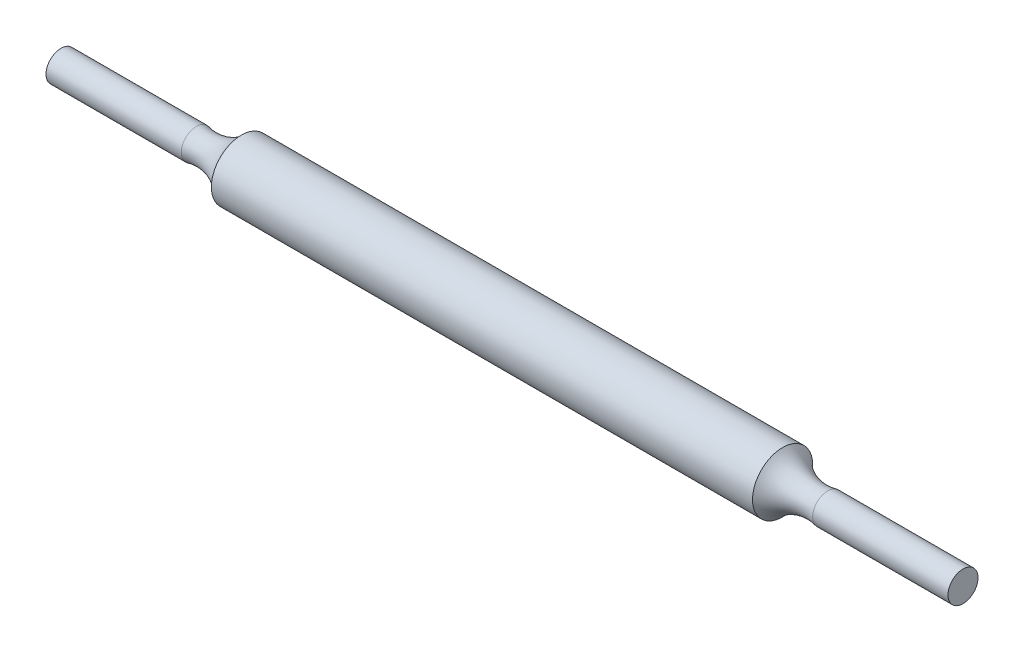
ISO-10303-21;
HEADER;
FILE_DESCRIPTION(('STEP AP214'),'2;1');
FILE_NAME('part.step','',(''),(''),'','','');
FILE_SCHEMA(('AUTOMOTIVE_DESIGN { 1 0 10303 214 1 1 1 1 }'));
ENDSEC;
DATA;
#1=APPLICATION_CONTEXT('core data for automotive mechanical design processes');
#2=APPLICATION_PROTOCOL_DEFINITION('international standard','automotive_design',2000,#1);
#3=PRODUCT_CONTEXT('',#1,'mechanical');
#4=PRODUCT('Part','Part','',(#3));
#5=PRODUCT_RELATED_PRODUCT_CATEGORY('part','',(#4));
#6=PRODUCT_DEFINITION_FORMATION('','',#4);
#7=PRODUCT_DEFINITION_CONTEXT('part definition',#1,'design');
#8=PRODUCT_DEFINITION('design','',#6,#7);
#9=PRODUCT_DEFINITION_SHAPE('','',#8);
#10=(LENGTH_UNIT() NAMED_UNIT(*) SI_UNIT(.MILLI.,.METRE.));
#11=(NAMED_UNIT(*) PLANE_ANGLE_UNIT() SI_UNIT($,.RADIAN.));
#12=(NAMED_UNIT(*) SI_UNIT($,.STERADIAN.) SOLID_ANGLE_UNIT());
#13=UNCERTAINTY_MEASURE_WITH_UNIT(LENGTH_MEASURE(1.E-05),#10,'distance_accuracy_value','');
#14=(GEOMETRIC_REPRESENTATION_CONTEXT(3) GLOBAL_UNCERTAINTY_ASSIGNED_CONTEXT((#13)) GLOBAL_UNIT_ASSIGNED_CONTEXT((#10,
#11,#12)) REPRESENTATION_CONTEXT('',''));
#15=CARTESIAN_POINT('',(0.,0.,0.));
#16=DIRECTION('',(0.,0.,1.));
#17=DIRECTION('',(1.,0.,0.));
#18=AXIS2_PLACEMENT_3D('',#15,#16,#17);
#19=CARTESIAN_POINT('',(-30.,0.,0.));
#20=DIRECTION('',(-1.,0.,0.));
#21=DIRECTION('',(0.,0.,1.));
#22=AXIS2_PLACEMENT_3D('',#19,#20,#21);
#23=CYLINDRICAL_SURFACE('',#22,2.);
#24=CARTESIAN_POINT('',(18.,0.,0.));
#25=DIRECTION('',(-1.,0.,0.));
#26=DIRECTION('',(0.,0.,1.));
#27=AXIS2_PLACEMENT_3D('',#24,#25,#26);
#28=CIRCLE('',#27,2.);
#29=CARTESIAN_POINT('',(18.,0.,2.));
#30=VERTEX_POINT('',#29);
#31=EDGE_CURVE('E55',#30,#30,#28,.T.);
#32=ORIENTED_EDGE('',*,*,#31,.T.);
#33=EDGE_LOOP('',(#32));
#34=FACE_BOUND('',#33,.T.);
#35=CARTESIAN_POINT('',(-18.,0.,0.));
#36=DIRECTION('',(-1.,0.,0.));
#37=DIRECTION('',(0.,0.,1.));
#38=AXIS2_PLACEMENT_3D('',#35,#36,#37);
#39=CIRCLE('',#38,2.);
#40=CARTESIAN_POINT('',(-18.,0.,2.));
#41=VERTEX_POINT('',#40);
#42=EDGE_CURVE('E10',#41,#41,#39,.T.);
#43=ORIENTED_EDGE('',*,*,#42,.F.);
#44=EDGE_LOOP('',(#43));
#45=FACE_BOUND('',#44,.T.);
#46=ADVANCED_FACE('F33',(#34,#45),#23,.T.);
#47=CARTESIAN_POINT('',(-20.3062257748299,0.,0.));
#48=DIRECTION('',(-1.,0.,0.));
#49=DIRECTION('',(0.,0.,1.));
#50=AXIS2_PLACEMENT_3D('',#47,#48,#49);
#51=TOROIDAL_SURFACE('',#50,3.91867732448957,3.);
#52=CARTESIAN_POINT('',(-21.,0.,0.));
#53=DIRECTION('',(-1.,0.,0.));
#54=DIRECTION('',(0.,0.,1.));
#55=AXIS2_PLACEMENT_3D('',#52,#53,#54);
#56=CIRCLE('',#55,0.999999999999999);
#57=CARTESIAN_POINT('',(-21.,0.,0.999999999999999));
#58=VERTEX_POINT('',#57);
#59=EDGE_CURVE('E39',#58,#58,#56,.T.);
#60=ORIENTED_EDGE('',*,*,#59,.F.);
#61=EDGE_LOOP('',(#60));
#62=FACE_BOUND('',#61,.T.);
#63=ORIENTED_EDGE('',*,*,#42,.T.);
#64=EDGE_LOOP('',(#63));
#65=FACE_BOUND('',#64,.T.);
#66=ADVANCED_FACE('F73',(#62,#65),#51,.F.);
#67=CARTESIAN_POINT('',(-30.,0.,0.));
#68=DIRECTION('',(-1.,0.,0.));
#69=DIRECTION('',(0.,0.,1.));
#70=AXIS2_PLACEMENT_3D('',#67,#68,#69);
#71=CYLINDRICAL_SURFACE('',#70,1.);
#72=ORIENTED_EDGE('',*,*,#59,.T.);
#73=EDGE_LOOP('',(#72));
#74=FACE_BOUND('',#73,.T.);
#75=CARTESIAN_POINT('',(-30.,0.,0.));
#76=DIRECTION('',(-1.,0.,0.));
#77=DIRECTION('',(0.,0.,1.));
#78=AXIS2_PLACEMENT_3D('',#75,#76,#77);
#79=CIRCLE('',#78,1.);
#80=CARTESIAN_POINT('',(-30.,0.,1.));
#81=VERTEX_POINT('',#80);
#82=EDGE_CURVE('E43',#81,#81,#79,.T.);
#83=ORIENTED_EDGE('',*,*,#82,.F.);
#84=EDGE_LOOP('',(#83));
#85=FACE_BOUND('',#84,.T.);
#86=ADVANCED_FACE('F77',(#74,#85),#71,.T.);
#87=CARTESIAN_POINT('',(-30.,0.,0.));
#88=DIRECTION('',(-1.,0.,0.));
#89=DIRECTION('',(0.,0.,1.));
#90=AXIS2_PLACEMENT_3D('',#87,#88,#89);
#91=PLANE('',#90);
#92=ORIENTED_EDGE('',*,*,#82,.T.);
#93=EDGE_LOOP('',(#92));
#94=FACE_BOUND('',#93,.T.);
#95=ADVANCED_FACE('F82',(#94),#91,.T.);
#96=CARTESIAN_POINT('',(30.,0.,0.));
#97=DIRECTION('',(-1.,0.,0.));
#98=DIRECTION('',(0.,0.,1.));
#99=AXIS2_PLACEMENT_3D('',#96,#97,#98);
#100=PLANE('',#99);
#101=CARTESIAN_POINT('',(30.,0.,0.));
#102=DIRECTION('',(-1.,0.,0.));
#103=DIRECTION('',(0.,0.,1.));
#104=AXIS2_PLACEMENT_3D('',#101,#102,#103);
#105=CIRCLE('',#104,1.);
#106=CARTESIAN_POINT('',(30.,0.,1.));
#107=VERTEX_POINT('',#106);
#108=EDGE_CURVE('E47',#107,#107,#105,.T.);
#109=ORIENTED_EDGE('',*,*,#108,.F.);
#110=EDGE_LOOP('',(#109));
#111=FACE_BOUND('',#110,.T.);
#112=ADVANCED_FACE('F69',(#111),#100,.F.);
#113=CARTESIAN_POINT('',(-30.,0.,0.));
#114=DIRECTION('',(-1.,0.,0.));
#115=DIRECTION('',(0.,0.,1.));
#116=AXIS2_PLACEMENT_3D('',#113,#114,#115);
#117=CYLINDRICAL_SURFACE('',#116,1.);
#118=CARTESIAN_POINT('',(21.,0.,0.));
#119=DIRECTION('',(-1.,0.,0.));
#120=DIRECTION('',(0.,0.,1.));
#121=AXIS2_PLACEMENT_3D('',#118,#119,#120);
#122=CIRCLE('',#121,0.999999999999999);
#123=CARTESIAN_POINT('',(21.,0.,0.999999999999999));
#124=VERTEX_POINT('',#123);
#125=EDGE_CURVE('E52',#124,#124,#122,.T.);
#126=ORIENTED_EDGE('',*,*,#125,.F.);
#127=EDGE_LOOP('',(#126));
#128=FACE_BOUND('',#127,.T.);
#129=ORIENTED_EDGE('',*,*,#108,.T.);
#130=EDGE_LOOP('',(#129));
#131=FACE_BOUND('',#130,.T.);
#132=ADVANCED_FACE('F63',(#128,#131),#117,.T.);
#133=CARTESIAN_POINT('',(20.3062257748299,0.,0.));
#134=DIRECTION('',(-1.,0.,0.));
#135=DIRECTION('',(0.,0.,1.));
#136=AXIS2_PLACEMENT_3D('',#133,#134,#135);
#137=TOROIDAL_SURFACE('',#136,3.91867732448957,3.00000000000001);
#138=ORIENTED_EDGE('',*,*,#125,.T.);
#139=EDGE_LOOP('',(#138));
#140=FACE_BOUND('',#139,.T.);
#141=ORIENTED_EDGE('',*,*,#31,.F.);
#142=EDGE_LOOP('',(#141));
#143=FACE_BOUND('',#142,.T.);
#144=ADVANCED_FACE('F61',(#140,#143),#137,.F.);
#145=CLOSED_SHELL('',(#46,#66,#86,#95,#112,#132,#144));
#146=MANIFOLD_SOLID_BREP('B2',#145);
#147=ADVANCED_BREP_SHAPE_REPRESENTATION('',(#18,#146),#14);
#148=SHAPE_DEFINITION_REPRESENTATION(#9,#147);
ENDSEC;
END-ISO-10303-21;
